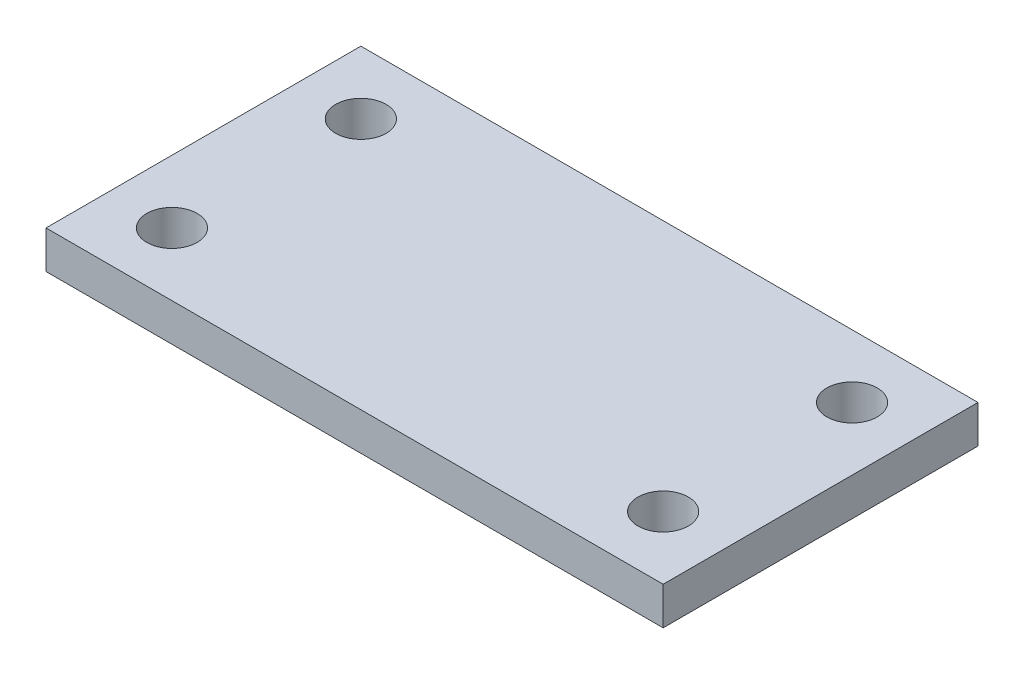
ISO-10303-21;
HEADER;
FILE_DESCRIPTION(('STEP AP214'),'2;1');
FILE_NAME('part.step','',(''),(''),'','','');
FILE_SCHEMA(('AUTOMOTIVE_DESIGN { 1 0 10303 214 1 1 1 1 }'));
ENDSEC;
DATA;
#1=APPLICATION_CONTEXT('core data for automotive mechanical design processes');
#2=APPLICATION_PROTOCOL_DEFINITION('international standard','automotive_design',2000,#1);
#3=PRODUCT_CONTEXT('',#1,'mechanical');
#4=PRODUCT('Part','Part','',(#3));
#5=PRODUCT_RELATED_PRODUCT_CATEGORY('part','',(#4));
#6=PRODUCT_DEFINITION_FORMATION('','',#4);
#7=PRODUCT_DEFINITION_CONTEXT('part definition',#1,'design');
#8=PRODUCT_DEFINITION('design','',#6,#7);
#9=PRODUCT_DEFINITION_SHAPE('','',#8);
#10=(LENGTH_UNIT() NAMED_UNIT(*) SI_UNIT(.MILLI.,.METRE.));
#11=(NAMED_UNIT(*) PLANE_ANGLE_UNIT() SI_UNIT($,.RADIAN.));
#12=(NAMED_UNIT(*) SI_UNIT($,.STERADIAN.) SOLID_ANGLE_UNIT());
#13=UNCERTAINTY_MEASURE_WITH_UNIT(LENGTH_MEASURE(1.E-05),#10,'distance_accuracy_value','');
#14=(GEOMETRIC_REPRESENTATION_CONTEXT(3) GLOBAL_UNCERTAINTY_ASSIGNED_CONTEXT((#13)) GLOBAL_UNIT_ASSIGNED_CONTEXT((#10,
#11,#12)) REPRESENTATION_CONTEXT('',''));
#15=CARTESIAN_POINT('',(0.,0.,0.));
#16=DIRECTION('',(0.,0.,1.));
#17=DIRECTION('',(1.,0.,0.));
#18=AXIS2_PLACEMENT_3D('',#15,#16,#17);
#19=CARTESIAN_POINT('',(17.3009478672986,3.,-13.9336492890995));
#20=DIRECTION('',(1.,0.,0.));
#21=DIRECTION('',(0.,0.,-1.));
#22=AXIS2_PLACEMENT_3D('',#19,#20,#21);
#23=PLANE('',#22);
#24=DIRECTION('',(0.,0.,1.));
#25=VECTOR('',#24,1.);
#26=CARTESIAN_POINT('',(17.3009478672986,0.,-13.9336492890995));
#27=LINE('',#26,#25);
#28=CARTESIAN_POINT('',(17.3009478672986,0.,-13.9336492890995));
#29=VERTEX_POINT('',#28);
#30=CARTESIAN_POINT('',(17.3009478672986,0.,11.0663507109005));
#31=VERTEX_POINT('',#30);
#32=EDGE_CURVE('E97',#29,#31,#27,.T.);
#33=ORIENTED_EDGE('',*,*,#32,.F.);
#34=DIRECTION('',(0.,-1.,0.));
#35=VECTOR('',#34,1.);
#36=CARTESIAN_POINT('',(17.3009478672986,3.,-13.9336492890995));
#37=LINE('',#36,#35);
#38=CARTESIAN_POINT('',(17.3009478672986,3.,-13.9336492890995));
#39=VERTEX_POINT('',#38);
#40=EDGE_CURVE('E11',#39,#29,#37,.T.);
#41=ORIENTED_EDGE('',*,*,#40,.F.);
#42=DIRECTION('',(0.,0.,1.));
#43=VECTOR('',#42,1.);
#44=CARTESIAN_POINT('',(17.3009478672986,3.,-13.9336492890995));
#45=LINE('',#44,#43);
#46=CARTESIAN_POINT('',(17.3009478672986,3.,11.0663507109005));
#47=VERTEX_POINT('',#46);
#48=EDGE_CURVE('E90',#39,#47,#45,.T.);
#49=ORIENTED_EDGE('',*,*,#48,.T.);
#50=DIRECTION('',(0.,-1.,0.));
#51=VECTOR('',#50,1.);
#52=CARTESIAN_POINT('',(17.3009478672986,3.,11.0663507109005));
#53=LINE('',#52,#51);
#54=EDGE_CURVE('E35',#47,#31,#53,.T.);
#55=ORIENTED_EDGE('',*,*,#54,.T.);
#56=EDGE_LOOP('',(#33,#41,#49,#55));
#57=FACE_BOUND('',#56,.T.);
#58=ADVANCED_FACE('F32',(#57),#23,.T.);
#59=CARTESIAN_POINT('',(-31.6990521327014,3.,-13.9336492890995));
#60=DIRECTION('',(0.,0.,-1.));
#61=DIRECTION('',(-1.,0.,0.));
#62=AXIS2_PLACEMENT_3D('',#59,#60,#61);
#63=PLANE('',#62);
#64=DIRECTION('',(1.,0.,0.));
#65=VECTOR('',#64,1.);
#66=CARTESIAN_POINT('',(-31.6990521327014,0.,-13.9336492890995));
#67=LINE('',#66,#65);
#68=CARTESIAN_POINT('',(-31.6990521327014,0.,-13.9336492890995));
#69=VERTEX_POINT('',#68);
#70=EDGE_CURVE('E92',#69,#29,#67,.T.);
#71=ORIENTED_EDGE('',*,*,#70,.F.);
#72=DIRECTION('',(0.,-1.,0.));
#73=VECTOR('',#72,1.);
#74=CARTESIAN_POINT('',(-31.6990521327014,3.,-13.9336492890995));
#75=LINE('',#74,#73);
#76=CARTESIAN_POINT('',(-31.6990521327014,3.,-13.9336492890995));
#77=VERTEX_POINT('',#76);
#78=EDGE_CURVE('E41',#77,#69,#75,.T.);
#79=ORIENTED_EDGE('',*,*,#78,.F.);
#80=DIRECTION('',(1.,0.,0.));
#81=VECTOR('',#80,1.);
#82=CARTESIAN_POINT('',(-31.6990521327014,3.,-13.9336492890995));
#83=LINE('',#82,#81);
#84=EDGE_CURVE('E87',#77,#39,#83,.T.);
#85=ORIENTED_EDGE('',*,*,#84,.T.);
#86=ORIENTED_EDGE('',*,*,#40,.T.);
#87=EDGE_LOOP('',(#71,#79,#85,#86));
#88=FACE_BOUND('',#87,.T.);
#89=ADVANCED_FACE('F108',(#88),#63,.T.);
#90=CARTESIAN_POINT('',(-31.6990521327014,3.,11.0663507109005));
#91=DIRECTION('',(-1.,0.,0.));
#92=DIRECTION('',(0.,0.,1.));
#93=AXIS2_PLACEMENT_3D('',#90,#91,#92);
#94=PLANE('',#93);
#95=DIRECTION('',(0.,0.,-1.));
#96=VECTOR('',#95,1.);
#97=CARTESIAN_POINT('',(-31.6990521327014,0.,11.0663507109005));
#98=LINE('',#97,#96);
#99=CARTESIAN_POINT('',(-31.6990521327014,0.,11.0663507109005));
#100=VERTEX_POINT('',#99);
#101=EDGE_CURVE('E82',#100,#69,#98,.T.);
#102=ORIENTED_EDGE('',*,*,#101,.F.);
#103=DIRECTION('',(0.,-1.,0.));
#104=VECTOR('',#103,1.);
#105=CARTESIAN_POINT('',(-31.6990521327014,3.,11.0663507109005));
#106=LINE('',#105,#104);
#107=CARTESIAN_POINT('',(-31.6990521327014,3.,11.0663507109005));
#108=VERTEX_POINT('',#107);
#109=EDGE_CURVE('E77',#108,#100,#106,.T.);
#110=ORIENTED_EDGE('',*,*,#109,.F.);
#111=DIRECTION('',(0.,0.,-1.));
#112=VECTOR('',#111,1.);
#113=CARTESIAN_POINT('',(-31.6990521327014,3.,11.0663507109005));
#114=LINE('',#113,#112);
#115=EDGE_CURVE('E80',#108,#77,#114,.T.);
#116=ORIENTED_EDGE('',*,*,#115,.T.);
#117=ORIENTED_EDGE('',*,*,#78,.T.);
#118=EDGE_LOOP('',(#102,#110,#116,#117));
#119=FACE_BOUND('',#118,.T.);
#120=ADVANCED_FACE('F79',(#119),#94,.T.);
#121=CARTESIAN_POINT('',(17.3009478672986,3.,11.0663507109005));
#122=DIRECTION('',(0.,0.,1.));
#123=DIRECTION('',(1.,0.,0.));
#124=AXIS2_PLACEMENT_3D('',#121,#122,#123);
#125=PLANE('',#124);
#126=DIRECTION('',(-1.,0.,0.));
#127=VECTOR('',#126,1.);
#128=CARTESIAN_POINT('',(17.3009478672986,0.,11.0663507109005));
#129=LINE('',#128,#127);
#130=EDGE_CURVE('E100',#31,#100,#129,.T.);
#131=ORIENTED_EDGE('',*,*,#130,.F.);
#132=ORIENTED_EDGE('',*,*,#54,.F.);
#133=DIRECTION('',(-1.,0.,0.));
#134=VECTOR('',#133,1.);
#135=CARTESIAN_POINT('',(17.3009478672986,3.,11.0663507109005));
#136=LINE('',#135,#134);
#137=EDGE_CURVE('E86',#47,#108,#136,.T.);
#138=ORIENTED_EDGE('',*,*,#137,.T.);
#139=ORIENTED_EDGE('',*,*,#109,.T.);
#140=EDGE_LOOP('',(#131,#132,#138,#139));
#141=FACE_BOUND('',#140,.T.);
#142=ADVANCED_FACE('F89',(#141),#125,.T.);
#143=CARTESIAN_POINT('',(0.,3.,0.));
#144=DIRECTION('',(0.,-1.,0.));
#145=DIRECTION('',(0.,0.,-1.));
#146=AXIS2_PLACEMENT_3D('',#143,#144,#145);
#147=PLANE('',#146);
#148=CARTESIAN_POINT('',(-26.6990521327014,3.,6.06635071090046));
#149=DIRECTION('',(0.,1.,0.));
#150=DIRECTION('',(0.,0.,1.));
#151=AXIS2_PLACEMENT_3D('',#148,#149,#150);
#152=CIRCLE('',#151,2.);
#153=CARTESIAN_POINT('',(-26.6990521327014,3.,8.06635071090046));
#154=VERTEX_POINT('',#153);
#155=EDGE_CURVE('E152',#154,#154,#152,.T.);
#156=ORIENTED_EDGE('',*,*,#155,.F.);
#157=EDGE_LOOP('',(#156));
#158=FACE_BOUND('',#157,.T.);
#159=CARTESIAN_POINT('',(12.3009478672986,3.,-8.93364928909953));
#160=DIRECTION('',(0.,1.,0.));
#161=DIRECTION('',(0.,0.,1.));
#162=AXIS2_PLACEMENT_3D('',#159,#160,#161);
#163=CIRCLE('',#162,2.);
#164=CARTESIAN_POINT('',(12.3009478672986,3.,-6.93364928909953));
#165=VERTEX_POINT('',#164);
#166=EDGE_CURVE('E158',#165,#165,#163,.T.);
#167=ORIENTED_EDGE('',*,*,#166,.F.);
#168=EDGE_LOOP('',(#167));
#169=FACE_BOUND('',#168,.T.);
#170=CARTESIAN_POINT('',(12.3009478672986,3.,6.06635071090046));
#171=DIRECTION('',(0.,1.,0.));
#172=DIRECTION('',(0.,0.,1.));
#173=AXIS2_PLACEMENT_3D('',#170,#171,#172);
#174=CIRCLE('',#173,2.);
#175=CARTESIAN_POINT('',(12.3009478672986,3.,8.06635071090046));
#176=VERTEX_POINT('',#175);
#177=EDGE_CURVE('E166',#176,#176,#174,.T.);
#178=ORIENTED_EDGE('',*,*,#177,.F.);
#179=EDGE_LOOP('',(#178));
#180=FACE_BOUND('',#179,.T.);
#181=CARTESIAN_POINT('',(-26.6990521327014,3.,-8.93364928909953));
#182=DIRECTION('',(0.,1.,0.));
#183=DIRECTION('',(0.,0.,1.));
#184=AXIS2_PLACEMENT_3D('',#181,#182,#183);
#185=CIRCLE('',#184,2.);
#186=CARTESIAN_POINT('',(-26.6990521327014,3.,-6.93364928909953));
#187=VERTEX_POINT('',#186);
#188=EDGE_CURVE('E155',#187,#187,#185,.T.);
#189=ORIENTED_EDGE('',*,*,#188,.F.);
#190=EDGE_LOOP('',(#189));
#191=FACE_BOUND('',#190,.T.);
#192=ORIENTED_EDGE('',*,*,#48,.F.);
#193=ORIENTED_EDGE('',*,*,#84,.F.);
#194=ORIENTED_EDGE('',*,*,#115,.F.);
#195=ORIENTED_EDGE('',*,*,#137,.F.);
#196=EDGE_LOOP('',(#192,#193,#194,#195));
#197=FACE_BOUND('',#196,.T.);
#198=ADVANCED_FACE('F85',(#158,#169,#180,#191,#197),#147,.F.);
#199=CARTESIAN_POINT('',(0.,0.,0.));
#200=DIRECTION('',(0.,-1.,0.));
#201=DIRECTION('',(0.,0.,-1.));
#202=AXIS2_PLACEMENT_3D('',#199,#200,#201);
#203=PLANE('',#202);
#204=CARTESIAN_POINT('',(-26.6990521327014,0.,6.06635071090046));
#205=DIRECTION('',(0.,1.,0.));
#206=DIRECTION('',(0.,0.,1.));
#207=AXIS2_PLACEMENT_3D('',#204,#205,#206);
#208=CIRCLE('',#207,2.);
#209=CARTESIAN_POINT('',(-26.6990521327014,0.,8.06635071090046));
#210=VERTEX_POINT('',#209);
#211=EDGE_CURVE('E150',#210,#210,#208,.T.);
#212=ORIENTED_EDGE('',*,*,#211,.T.);
#213=EDGE_LOOP('',(#212));
#214=FACE_BOUND('',#213,.T.);
#215=CARTESIAN_POINT('',(12.3009478672986,0.,-8.93364928909953));
#216=DIRECTION('',(0.,1.,0.));
#217=DIRECTION('',(0.,0.,1.));
#218=AXIS2_PLACEMENT_3D('',#215,#216,#217);
#219=CIRCLE('',#218,2.);
#220=CARTESIAN_POINT('',(12.3009478672986,0.,-6.93364928909953));
#221=VERTEX_POINT('',#220);
#222=EDGE_CURVE('E153',#221,#221,#219,.T.);
#223=ORIENTED_EDGE('',*,*,#222,.T.);
#224=EDGE_LOOP('',(#223));
#225=FACE_BOUND('',#224,.T.);
#226=CARTESIAN_POINT('',(12.3009478672986,0.,6.06635071090046));
#227=DIRECTION('',(0.,1.,0.));
#228=DIRECTION('',(0.,0.,1.));
#229=AXIS2_PLACEMENT_3D('',#226,#227,#228);
#230=CIRCLE('',#229,2.);
#231=CARTESIAN_POINT('',(12.3009478672986,0.,8.06635071090046));
#232=VERTEX_POINT('',#231);
#233=EDGE_CURVE('E163',#232,#232,#230,.T.);
#234=ORIENTED_EDGE('',*,*,#233,.T.);
#235=EDGE_LOOP('',(#234));
#236=FACE_BOUND('',#235,.T.);
#237=CARTESIAN_POINT('',(-26.6990521327014,0.,-8.93364928909953));
#238=DIRECTION('',(0.,1.,0.));
#239=DIRECTION('',(0.,0.,1.));
#240=AXIS2_PLACEMENT_3D('',#237,#238,#239);
#241=CIRCLE('',#240,2.);
#242=CARTESIAN_POINT('',(-26.6990521327014,0.,-6.93364928909953));
#243=VERTEX_POINT('',#242);
#244=EDGE_CURVE('E101',#243,#243,#241,.T.);
#245=ORIENTED_EDGE('',*,*,#244,.T.);
#246=EDGE_LOOP('',(#245));
#247=FACE_BOUND('',#246,.T.);
#248=ORIENTED_EDGE('',*,*,#32,.T.);
#249=ORIENTED_EDGE('',*,*,#130,.T.);
#250=ORIENTED_EDGE('',*,*,#101,.T.);
#251=ORIENTED_EDGE('',*,*,#70,.T.);
#252=EDGE_LOOP('',(#248,#249,#250,#251));
#253=FACE_BOUND('',#252,.T.);
#254=ADVANCED_FACE('F107',(#214,#225,#236,#247,#253),#203,.T.);
#255=CARTESIAN_POINT('',(-26.6990521327014,0.,-8.93364928909953));
#256=DIRECTION('',(0.,1.,0.));
#257=DIRECTION('',(0.,0.,1.));
#258=AXIS2_PLACEMENT_3D('',#255,#256,#257);
#259=CYLINDRICAL_SURFACE('',#258,2.);
#260=ORIENTED_EDGE('',*,*,#244,.F.);
#261=EDGE_LOOP('',(#260));
#262=FACE_BOUND('',#261,.T.);
#263=ORIENTED_EDGE('',*,*,#188,.T.);
#264=EDGE_LOOP('',(#263));
#265=FACE_BOUND('',#264,.T.);
#266=ADVANCED_FACE('F126',(#262,#265),#259,.F.);
#267=CARTESIAN_POINT('',(12.3009478672986,0.,6.06635071090046));
#268=DIRECTION('',(0.,1.,0.));
#269=DIRECTION('',(0.,0.,1.));
#270=AXIS2_PLACEMENT_3D('',#267,#268,#269);
#271=CYLINDRICAL_SURFACE('',#270,2.);
#272=ORIENTED_EDGE('',*,*,#233,.F.);
#273=EDGE_LOOP('',(#272));
#274=FACE_BOUND('',#273,.T.);
#275=ORIENTED_EDGE('',*,*,#177,.T.);
#276=EDGE_LOOP('',(#275));
#277=FACE_BOUND('',#276,.T.);
#278=ADVANCED_FACE('F133',(#274,#277),#271,.F.);
#279=CARTESIAN_POINT('',(12.3009478672986,0.,-8.93364928909953));
#280=DIRECTION('',(0.,1.,0.));
#281=DIRECTION('',(0.,0.,1.));
#282=AXIS2_PLACEMENT_3D('',#279,#280,#281);
#283=CYLINDRICAL_SURFACE('',#282,2.);
#284=ORIENTED_EDGE('',*,*,#222,.F.);
#285=EDGE_LOOP('',(#284));
#286=FACE_BOUND('',#285,.T.);
#287=ORIENTED_EDGE('',*,*,#166,.T.);
#288=EDGE_LOOP('',(#287));
#289=FACE_BOUND('',#288,.T.);
#290=ADVANCED_FACE('F137',(#286,#289),#283,.F.);
#291=CARTESIAN_POINT('',(-26.6990521327014,0.,6.06635071090046));
#292=DIRECTION('',(0.,1.,0.));
#293=DIRECTION('',(0.,0.,1.));
#294=AXIS2_PLACEMENT_3D('',#291,#292,#293);
#295=CYLINDRICAL_SURFACE('',#294,2.);
#296=ORIENTED_EDGE('',*,*,#211,.F.);
#297=EDGE_LOOP('',(#296));
#298=FACE_BOUND('',#297,.T.);
#299=ORIENTED_EDGE('',*,*,#155,.T.);
#300=EDGE_LOOP('',(#299));
#301=FACE_BOUND('',#300,.T.);
#302=ADVANCED_FACE('F141',(#298,#301),#295,.F.);
#303=CLOSED_SHELL('',(#58,#89,#120,#142,#198,#254,#266,#278,#290,#302));
#304=MANIFOLD_SOLID_BREP('B2',#303);
#305=ADVANCED_BREP_SHAPE_REPRESENTATION('',(#18,#304),#14);
#306=SHAPE_DEFINITION_REPRESENTATION(#9,#305);
ENDSEC;
END-ISO-10303-21;
